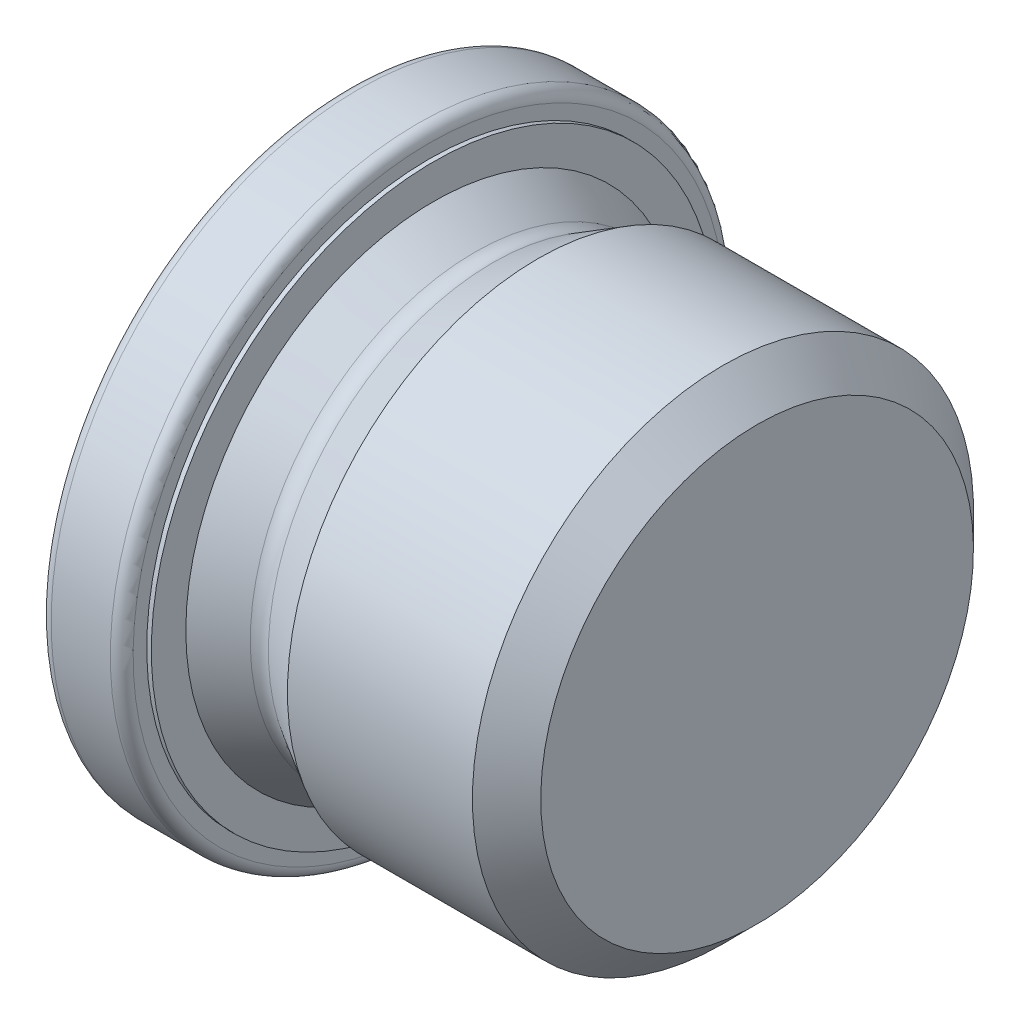
ISO-10303-21;
HEADER;
FILE_DESCRIPTION(('STEP AP214'),'2;1');
FILE_NAME('part.step','',(''),(''),'','','');
FILE_SCHEMA(('AUTOMOTIVE_DESIGN { 1 0 10303 214 1 1 1 1 }'));
ENDSEC;
DATA;
#1=APPLICATION_CONTEXT('core data for automotive mechanical design processes');
#2=APPLICATION_PROTOCOL_DEFINITION('international standard','automotive_design',2000,#1);
#3=PRODUCT_CONTEXT('',#1,'mechanical');
#4=PRODUCT('Part','Part','',(#3));
#5=PRODUCT_RELATED_PRODUCT_CATEGORY('part','',(#4));
#6=PRODUCT_DEFINITION_FORMATION('','',#4);
#7=PRODUCT_DEFINITION_CONTEXT('part definition',#1,'design');
#8=PRODUCT_DEFINITION('design','',#6,#7);
#9=PRODUCT_DEFINITION_SHAPE('','',#8);
#10=(LENGTH_UNIT() NAMED_UNIT(*) SI_UNIT(.MILLI.,.METRE.));
#11=(NAMED_UNIT(*) PLANE_ANGLE_UNIT() SI_UNIT($,.RADIAN.));
#12=(NAMED_UNIT(*) SI_UNIT($,.STERADIAN.) SOLID_ANGLE_UNIT());
#13=UNCERTAINTY_MEASURE_WITH_UNIT(LENGTH_MEASURE(1.E-05),#10,'distance_accuracy_value','');
#14=(GEOMETRIC_REPRESENTATION_CONTEXT(3) GLOBAL_UNCERTAINTY_ASSIGNED_CONTEXT((#13)) GLOBAL_UNIT_ASSIGNED_CONTEXT((#10,
#11,#12)) REPRESENTATION_CONTEXT('',''));
#15=CARTESIAN_POINT('',(0.,0.,0.));
#16=DIRECTION('',(0.,0.,1.));
#17=DIRECTION('',(1.,0.,0.));
#18=AXIS2_PLACEMENT_3D('',#15,#16,#17);
#19=CARTESIAN_POINT('',(-18.,13.5,0.));
#20=DIRECTION('',(-1.,0.,0.));
#21=DIRECTION('',(0.,-1.,0.));
#22=AXIS2_PLACEMENT_3D('',#19,#20,#21);
#23=PLANE('',#22);
#24=CARTESIAN_POINT('',(-18.,0.,0.));
#25=DIRECTION('',(-1.,0.,0.));
#26=DIRECTION('',(0.,-1.,0.));
#27=AXIS2_PLACEMENT_3D('',#24,#25,#26);
#28=CIRCLE('',#27,13.);
#29=CARTESIAN_POINT('',(-18.,-13.,0.));
#30=VERTEX_POINT('',#29);
#31=EDGE_CURVE('E171',#30,#30,#28,.T.);
#32=ORIENTED_EDGE('',*,*,#31,.T.);
#33=EDGE_LOOP('',(#32));
#34=FACE_BOUND('',#33,.T.);
#35=DIRECTION('',(0.,-1.,0.));
#36=VECTOR('',#35,1.);
#37=CARTESIAN_POINT('',(-18.,4.8,-4.8));
#38=LINE('',#37,#36);
#39=CARTESIAN_POINT('',(-18.,4.8,-4.8));
#40=VERTEX_POINT('',#39);
#41=CARTESIAN_POINT('',(-18.,-4.8,-4.8));
#42=VERTEX_POINT('',#41);
#43=EDGE_CURVE('E65',#40,#42,#38,.T.);
#44=ORIENTED_EDGE('',*,*,#43,.F.);
#45=DIRECTION('',(0.,0.,-1.));
#46=VECTOR('',#45,1.);
#47=CARTESIAN_POINT('',(-18.,4.8,4.8));
#48=LINE('',#47,#46);
#49=CARTESIAN_POINT('',(-18.,4.8,4.8));
#50=VERTEX_POINT('',#49);
#51=EDGE_CURVE('E121',#50,#40,#48,.T.);
#52=ORIENTED_EDGE('',*,*,#51,.F.);
#53=DIRECTION('',(0.,1.,0.));
#54=VECTOR('',#53,1.);
#55=CARTESIAN_POINT('',(-18.,-4.8,4.8));
#56=LINE('',#55,#54);
#57=CARTESIAN_POINT('',(-18.,-4.8,4.8));
#58=VERTEX_POINT('',#57);
#59=EDGE_CURVE('E132',#58,#50,#56,.T.);
#60=ORIENTED_EDGE('',*,*,#59,.F.);
#61=DIRECTION('',(0.,0.,1.));
#62=VECTOR('',#61,1.);
#63=CARTESIAN_POINT('',(-18.,-4.8,-4.8));
#64=LINE('',#63,#62);
#65=EDGE_CURVE('E100',#42,#58,#64,.T.);
#66=ORIENTED_EDGE('',*,*,#65,.F.);
#67=EDGE_LOOP('',(#44,#52,#60,#66));
#68=FACE_BOUND('',#67,.T.);
#69=ADVANCED_FACE('F49',(#34,#68),#23,.T.);
#70=CARTESIAN_POINT('',(0.,0.,0.));
#71=DIRECTION('',(1.,0.,0.));
#72=DIRECTION('',(0.,1.,0.));
#73=AXIS2_PLACEMENT_3D('',#70,#71,#72);
#74=CYLINDRICAL_SURFACE('',#73,13.5);
#75=CARTESIAN_POINT('',(-17.5,0.,0.));
#76=DIRECTION('',(-1.,0.,0.));
#77=DIRECTION('',(0.,-1.,0.));
#78=AXIS2_PLACEMENT_3D('',#75,#76,#77);
#79=CIRCLE('',#78,13.5);
#80=CARTESIAN_POINT('',(-17.5,-13.5,0.));
#81=VERTEX_POINT('',#80);
#82=EDGE_CURVE('E167',#81,#81,#79,.F.);
#83=ORIENTED_EDGE('',*,*,#82,.T.);
#84=EDGE_LOOP('',(#83));
#85=FACE_BOUND('',#84,.T.);
#86=CARTESIAN_POINT('',(-14.9,0.,0.));
#87=DIRECTION('',(1.,0.,0.));
#88=DIRECTION('',(0.,1.,0.));
#89=AXIS2_PLACEMENT_3D('',#86,#87,#88);
#90=CIRCLE('',#89,13.5);
#91=CARTESIAN_POINT('',(-14.9,13.5,0.));
#92=VERTEX_POINT('',#91);
#93=EDGE_CURVE('E163',#92,#92,#90,.F.);
#94=ORIENTED_EDGE('',*,*,#93,.T.);
#95=EDGE_LOOP('',(#94));
#96=FACE_BOUND('',#95,.T.);
#97=ADVANCED_FACE('F227',(#85,#96),#74,.T.);
#98=CARTESIAN_POINT('',(-14.4,11.,0.));
#99=DIRECTION('',(1.,0.,0.));
#100=DIRECTION('',(0.,1.,0.));
#101=AXIS2_PLACEMENT_3D('',#98,#99,#100);
#102=PLANE('',#101);
#103=CARTESIAN_POINT('',(-14.4,0.,0.));
#104=DIRECTION('',(1.,0.,0.));
#105=DIRECTION('',(0.,1.,0.));
#106=AXIS2_PLACEMENT_3D('',#103,#104,#105);
#107=CIRCLE('',#106,12.4);
#108=CARTESIAN_POINT('',(-14.4,12.4,0.));
#109=VERTEX_POINT('',#108);
#110=EDGE_CURVE('E11',#109,#109,#107,.T.);
#111=ORIENTED_EDGE('',*,*,#110,.F.);
#112=EDGE_LOOP('',(#111));
#113=FACE_BOUND('',#112,.T.);
#114=CARTESIAN_POINT('',(-14.4,0.,0.));
#115=DIRECTION('',(1.,0.,0.));
#116=DIRECTION('',(0.,1.,0.));
#117=AXIS2_PLACEMENT_3D('',#114,#115,#116);
#118=CIRCLE('',#117,13.);
#119=CARTESIAN_POINT('',(-14.4,13.,0.));
#120=VERTEX_POINT('',#119);
#121=EDGE_CURVE('E175',#120,#120,#118,.T.);
#122=ORIENTED_EDGE('',*,*,#121,.T.);
#123=EDGE_LOOP('',(#122));
#124=FACE_BOUND('',#123,.T.);
#125=ADVANCED_FACE('F234',(#113,#124),#102,.T.);
#126=CARTESIAN_POINT('',(-7.99999999999999,4.8,-4.8));
#127=DIRECTION('',(0.,0.,-1.));
#128=DIRECTION('',(0.,1.,0.));
#129=AXIS2_PLACEMENT_3D('',#126,#127,#128);
#130=PLANE('',#129);
#131=ORIENTED_EDGE('',*,*,#43,.T.);
#132=DIRECTION('',(-1.,0.,0.));
#133=VECTOR('',#132,1.);
#134=CARTESIAN_POINT('',(-7.99999999999999,-4.8,-4.8));
#135=LINE('',#134,#133);
#136=CARTESIAN_POINT('',(-7.99999999999999,-4.8,-4.8));
#137=VERTEX_POINT('',#136);
#138=EDGE_CURVE('E88',#137,#42,#135,.T.);
#139=ORIENTED_EDGE('',*,*,#138,.F.);
#140=DIRECTION('',(0.,-1.,0.));
#141=VECTOR('',#140,1.);
#142=CARTESIAN_POINT('',(-7.99999999999999,4.8,-4.8));
#143=LINE('',#142,#141);
#144=CARTESIAN_POINT('',(-7.99999999999999,4.8,-4.8));
#145=VERTEX_POINT('',#144);
#146=EDGE_CURVE('E116',#145,#137,#143,.T.);
#147=ORIENTED_EDGE('',*,*,#146,.F.);
#148=DIRECTION('',(-1.,0.,0.));
#149=VECTOR('',#148,1.);
#150=CARTESIAN_POINT('',(-7.99999999999999,4.8,-4.8));
#151=LINE('',#150,#149);
#152=EDGE_CURVE('E73',#145,#40,#151,.T.);
#153=ORIENTED_EDGE('',*,*,#152,.T.);
#154=EDGE_LOOP('',(#131,#139,#147,#153));
#155=FACE_BOUND('',#154,.T.);
#156=ADVANCED_FACE('F256',(#155),#130,.F.);
#157=CARTESIAN_POINT('',(-7.99999999999999,4.8,4.8));
#158=DIRECTION('',(0.,1.,0.));
#159=DIRECTION('',(0.,0.,1.));
#160=AXIS2_PLACEMENT_3D('',#157,#158,#159);
#161=PLANE('',#160);
#162=ORIENTED_EDGE('',*,*,#51,.T.);
#163=ORIENTED_EDGE('',*,*,#152,.F.);
#164=DIRECTION('',(0.,0.,-1.));
#165=VECTOR('',#164,1.);
#166=CARTESIAN_POINT('',(-7.99999999999999,4.8,4.8));
#167=LINE('',#166,#165);
#168=CARTESIAN_POINT('',(-7.99999999999999,4.8,4.8));
#169=VERTEX_POINT('',#168);
#170=EDGE_CURVE('E113',#169,#145,#167,.T.);
#171=ORIENTED_EDGE('',*,*,#170,.F.);
#172=DIRECTION('',(-1.,0.,0.));
#173=VECTOR('',#172,1.);
#174=CARTESIAN_POINT('',(-7.99999999999999,4.8,4.8));
#175=LINE('',#174,#173);
#176=EDGE_CURVE('E105',#169,#50,#175,.T.);
#177=ORIENTED_EDGE('',*,*,#176,.T.);
#178=EDGE_LOOP('',(#162,#163,#171,#177));
#179=FACE_BOUND('',#178,.T.);
#180=ADVANCED_FACE('F261',(#179),#161,.F.);
#181=CARTESIAN_POINT('',(-7.99999999999999,-4.8,4.8));
#182=DIRECTION('',(0.,0.,1.));
#183=DIRECTION('',(0.,-1.,0.));
#184=AXIS2_PLACEMENT_3D('',#181,#182,#183);
#185=PLANE('',#184);
#186=ORIENTED_EDGE('',*,*,#59,.T.);
#187=ORIENTED_EDGE('',*,*,#176,.F.);
#188=DIRECTION('',(0.,1.,0.));
#189=VECTOR('',#188,1.);
#190=CARTESIAN_POINT('',(-7.99999999999999,-4.8,4.8));
#191=LINE('',#190,#189);
#192=CARTESIAN_POINT('',(-7.99999999999999,-4.8,4.8));
#193=VERTEX_POINT('',#192);
#194=EDGE_CURVE('E108',#193,#169,#191,.T.);
#195=ORIENTED_EDGE('',*,*,#194,.F.);
#196=DIRECTION('',(-1.,0.,0.));
#197=VECTOR('',#196,1.);
#198=CARTESIAN_POINT('',(-7.99999999999999,-4.8,4.8));
#199=LINE('',#198,#197);
#200=EDGE_CURVE('E93',#193,#58,#199,.T.);
#201=ORIENTED_EDGE('',*,*,#200,.T.);
#202=EDGE_LOOP('',(#186,#187,#195,#201));
#203=FACE_BOUND('',#202,.T.);
#204=ADVANCED_FACE('F109',(#203),#185,.F.);
#205=CARTESIAN_POINT('',(-7.99999999999999,-4.8,-4.8));
#206=DIRECTION('',(0.,-1.,0.));
#207=DIRECTION('',(1.,0.,0.));
#208=AXIS2_PLACEMENT_3D('',#205,#206,#207);
#209=PLANE('',#208);
#210=ORIENTED_EDGE('',*,*,#65,.T.);
#211=ORIENTED_EDGE('',*,*,#200,.F.);
#212=DIRECTION('',(0.,0.,1.));
#213=VECTOR('',#212,1.);
#214=CARTESIAN_POINT('',(-7.99999999999999,-4.8,-4.8));
#215=LINE('',#214,#213);
#216=EDGE_CURVE('E97',#137,#193,#215,.T.);
#217=ORIENTED_EDGE('',*,*,#216,.F.);
#218=ORIENTED_EDGE('',*,*,#138,.T.);
#219=EDGE_LOOP('',(#210,#211,#217,#218));
#220=FACE_BOUND('',#219,.T.);
#221=ADVANCED_FACE('F95',(#220),#209,.F.);
#222=CARTESIAN_POINT('',(-7.99999999999999,-4.8,-4.8));
#223=DIRECTION('',(-1.,0.,0.));
#224=DIRECTION('',(0.,0.,1.));
#225=AXIS2_PLACEMENT_3D('',#222,#223,#224);
#226=PLANE('',#225);
#227=ORIENTED_EDGE('',*,*,#146,.T.);
#228=ORIENTED_EDGE('',*,*,#216,.T.);
#229=ORIENTED_EDGE('',*,*,#194,.T.);
#230=ORIENTED_EDGE('',*,*,#170,.T.);
#231=EDGE_LOOP('',(#227,#228,#229,#230));
#232=FACE_BOUND('',#231,.T.);
#233=ADVANCED_FACE('F115',(#232),#226,.T.);
#234=CARTESIAN_POINT('',(-17.5,0.,0.));
#235=DIRECTION('',(-1.,0.,0.));
#236=DIRECTION('',(0.,-1.,0.));
#237=AXIS2_PLACEMENT_3D('',#234,#235,#236);
#238=TOROIDAL_SURFACE('',#237,13.,0.5);
#239=ORIENTED_EDGE('',*,*,#31,.F.);
#240=EDGE_LOOP('',(#239));
#241=FACE_BOUND('',#240,.T.);
#242=ORIENTED_EDGE('',*,*,#82,.F.);
#243=EDGE_LOOP('',(#242));
#244=FACE_BOUND('',#243,.T.);
#245=ADVANCED_FACE('F239',(#241,#244),#238,.T.);
#246=CARTESIAN_POINT('',(-14.9,0.,0.));
#247=DIRECTION('',(1.,0.,0.));
#248=DIRECTION('',(0.,1.,0.));
#249=AXIS2_PLACEMENT_3D('',#246,#247,#248);
#250=TOROIDAL_SURFACE('',#249,13.,0.5);
#251=ORIENTED_EDGE('',*,*,#93,.F.);
#252=EDGE_LOOP('',(#251));
#253=FACE_BOUND('',#252,.T.);
#254=ORIENTED_EDGE('',*,*,#121,.F.);
#255=EDGE_LOOP('',(#254));
#256=FACE_BOUND('',#255,.T.);
#257=ADVANCED_FACE('F51',(#253,#256),#250,.T.);
#258=CARTESIAN_POINT('',(0.,0.,0.));
#259=DIRECTION('',(1.,0.,0.));
#260=DIRECTION('',(0.,0.,-1.));
#261=AXIS2_PLACEMENT_3D('',#258,#259,#260);
#262=CYLINDRICAL_SURFACE('',#261,12.4);
#263=ORIENTED_EDGE('',*,*,#110,.T.);
#264=EDGE_LOOP('',(#263));
#265=FACE_BOUND('',#264,.T.);
#266=CARTESIAN_POINT('',(-14.2,0.,0.));
#267=DIRECTION('',(1.,0.,0.));
#268=DIRECTION('',(0.,0.,-1.));
#269=AXIS2_PLACEMENT_3D('',#266,#267,#268);
#270=CIRCLE('',#269,12.4);
#271=CARTESIAN_POINT('',(-14.2,0.,-12.4));
#272=VERTEX_POINT('',#271);
#273=EDGE_CURVE('E129',#272,#272,#270,.T.);
#274=ORIENTED_EDGE('',*,*,#273,.F.);
#275=EDGE_LOOP('',(#274));
#276=FACE_BOUND('',#275,.T.);
#277=ADVANCED_FACE('F223',(#265,#276),#262,.T.);
#278=CARTESIAN_POINT('',(-14.2,10.4,0.));
#279=DIRECTION('',(1.,0.,0.));
#280=DIRECTION('',(0.,0.,-1.));
#281=AXIS2_PLACEMENT_3D('',#278,#279,#280);
#282=PLANE('',#281);
#283=CARTESIAN_POINT('',(-14.2,0.,0.));
#284=DIRECTION('',(1.,0.,0.));
#285=DIRECTION('',(0.,0.,-1.));
#286=AXIS2_PLACEMENT_3D('',#283,#284,#285);
#287=CIRCLE('',#286,10.8856100802855);
#288=CARTESIAN_POINT('',(-14.2,0.,-10.8856100802855));
#289=VERTEX_POINT('',#288);
#290=EDGE_CURVE('E58',#289,#289,#287,.F.);
#291=ORIENTED_EDGE('',*,*,#290,.T.);
#292=EDGE_LOOP('',(#291));
#293=FACE_BOUND('',#292,.T.);
#294=ORIENTED_EDGE('',*,*,#273,.T.);
#295=EDGE_LOOP('',(#294));
#296=FACE_BOUND('',#295,.T.);
#297=ADVANCED_FACE('F183',(#293,#296),#282,.T.);
#298=CARTESIAN_POINT('',(0.,0.,0.));
#299=DIRECTION('',(1.,0.,0.));
#300=DIRECTION('',(0.,1.,0.));
#301=AXIS2_PLACEMENT_3D('',#298,#299,#300);
#302=PLANE('',#301);
#303=CARTESIAN_POINT('',(0.,0.,0.));
#304=DIRECTION('',(1.,0.,0.));
#305=DIRECTION('',(0.,1.,0.));
#306=AXIS2_PLACEMENT_3D('',#303,#304,#305);
#307=CIRCLE('',#306,9.5);
#308=CARTESIAN_POINT('',(0.,9.5,0.));
#309=VERTEX_POINT('',#308);
#310=EDGE_CURVE('E139',#309,#309,#307,.T.);
#311=ORIENTED_EDGE('',*,*,#310,.T.);
#312=EDGE_LOOP('',(#311));
#313=FACE_BOUND('',#312,.T.);
#314=ADVANCED_FACE('F213',(#313),#302,.T.);
#315=CARTESIAN_POINT('',(0.,0.,0.));
#316=DIRECTION('',(-1.,0.,0.));
#317=DIRECTION('',(0.,-1.,0.));
#318=AXIS2_PLACEMENT_3D('',#315,#316,#317);
#319=CONICAL_SURFACE('',#318,9.5,0.785398163397446);
#320=CARTESIAN_POINT('',(-1.50000000000001,0.,0.));
#321=DIRECTION('',(1.,0.,0.));
#322=DIRECTION('',(0.,1.,0.));
#323=AXIS2_PLACEMENT_3D('',#320,#321,#322);
#324=CIRCLE('',#323,11.);
#325=CARTESIAN_POINT('',(-1.50000000000001,11.,0.));
#326=VERTEX_POINT('',#325);
#327=EDGE_CURVE('E147',#326,#326,#324,.T.);
#328=ORIENTED_EDGE('',*,*,#327,.T.);
#329=EDGE_LOOP('',(#328));
#330=FACE_BOUND('',#329,.T.);
#331=ORIENTED_EDGE('',*,*,#310,.F.);
#332=EDGE_LOOP('',(#331));
#333=FACE_BOUND('',#332,.T.);
#334=ADVANCED_FACE('F207',(#330,#333),#319,.T.);
#335=CARTESIAN_POINT('',(0.,0.,0.));
#336=DIRECTION('',(1.,0.,0.));
#337=DIRECTION('',(0.,1.,0.));
#338=AXIS2_PLACEMENT_3D('',#335,#336,#337);
#339=CYLINDRICAL_SURFACE('',#338,11.);
#340=CARTESIAN_POINT('',(-9.62245016616939,0.,0.));
#341=DIRECTION('',(1.,0.,0.));
#342=DIRECTION('',(0.,1.,0.));
#343=AXIS2_PLACEMENT_3D('',#340,#341,#342);
#344=CIRCLE('',#343,11.);
#345=CARTESIAN_POINT('',(-9.62245016616939,11.,0.));
#346=VERTEX_POINT('',#345);
#347=EDGE_CURVE('E151',#346,#346,#344,.T.);
#348=ORIENTED_EDGE('',*,*,#347,.T.);
#349=EDGE_LOOP('',(#348));
#350=FACE_BOUND('',#349,.T.);
#351=ORIENTED_EDGE('',*,*,#327,.F.);
#352=EDGE_LOOP('',(#351));
#353=FACE_BOUND('',#352,.T.);
#354=ADVANCED_FACE('F201',(#350,#353),#339,.T.);
#355=CARTESIAN_POINT('',(-9.62245016616939,0.,0.));
#356=DIRECTION('',(1.,0.,0.));
#357=DIRECTION('',(0.,1.,0.));
#358=AXIS2_PLACEMENT_3D('',#355,#356,#357);
#359=CONICAL_SURFACE('',#358,11.,0.523598775598302);
#360=CARTESIAN_POINT('',(-11.6018730295754,0.,0.));
#361=DIRECTION('',(1.,0.,0.));
#362=DIRECTION('',(0.,1.,0.));
#363=AXIS2_PLACEMENT_3D('',#360,#361,#362);
#364=CIRCLE('',#363,9.85717967697245);
#365=CARTESIAN_POINT('',(-11.6018730295754,9.85717967697245,0.));
#366=VERTEX_POINT('',#365);
#367=EDGE_CURVE('E155',#366,#366,#364,.T.);
#368=ORIENTED_EDGE('',*,*,#367,.T.);
#369=EDGE_LOOP('',(#368));
#370=FACE_BOUND('',#369,.T.);
#371=ORIENTED_EDGE('',*,*,#347,.F.);
#372=EDGE_LOOP('',(#371));
#373=FACE_BOUND('',#372,.T.);
#374=ADVANCED_FACE('F195',(#370,#373),#359,.T.);
#375=CARTESIAN_POINT('',(-12.0018730295754,0.,0.));
#376=DIRECTION('',(1.,0.,0.));
#377=DIRECTION('',(0.,1.,0.));
#378=AXIS2_PLACEMENT_3D('',#375,#376,#377);
#379=TOROIDAL_SURFACE('',#378,10.55,0.799999999999999);
#380=CARTESIAN_POINT('',(-12.3990569072989,0.,0.));
#381=DIRECTION('',(1.,0.,0.));
#382=DIRECTION('',(0.,1.,0.));
#383=AXIS2_PLACEMENT_3D('',#380,#381,#382);
#384=CIRCLE('',#383,9.85556140136328);
#385=CARTESIAN_POINT('',(-12.3990569072989,9.85556140136328,0.));
#386=VERTEX_POINT('',#385);
#387=EDGE_CURVE('E159',#386,#386,#384,.T.);
#388=ORIENTED_EDGE('',*,*,#387,.T.);
#389=EDGE_LOOP('',(#388));
#390=FACE_BOUND('',#389,.T.);
#391=ORIENTED_EDGE('',*,*,#367,.F.);
#392=EDGE_LOOP('',(#391));
#393=FACE_BOUND('',#392,.T.);
#394=ADVANCED_FACE('F189',(#390,#393),#379,.F.);
#395=CARTESIAN_POINT('',(-12.3990569072989,0.,0.));
#396=DIRECTION('',(-1.,0.,0.));
#397=DIRECTION('',(0.,-1.,0.));
#398=AXIS2_PLACEMENT_3D('',#395,#396,#397);
#399=CONICAL_SURFACE('',#398,9.85556140136328,0.519538800399343);
#400=ORIENTED_EDGE('',*,*,#290,.F.);
#401=EDGE_LOOP('',(#400));
#402=FACE_BOUND('',#401,.T.);
#403=ORIENTED_EDGE('',*,*,#387,.F.);
#404=EDGE_LOOP('',(#403));
#405=FACE_BOUND('',#404,.T.);
#406=ADVANCED_FACE('F186',(#402,#405),#399,.T.);
#407=CLOSED_SHELL('',(#69,#97,#125,#156,#180,#204,#221,#233,#245,#257,#277,#297,#314,#334,#354,
#374,#394,#406));
#408=MANIFOLD_SOLID_BREP('B2',#407);
#409=ADVANCED_BREP_SHAPE_REPRESENTATION('',(#18,#408),#14);
#410=SHAPE_DEFINITION_REPRESENTATION(#9,#409);
ENDSEC;
END-ISO-10303-21;
